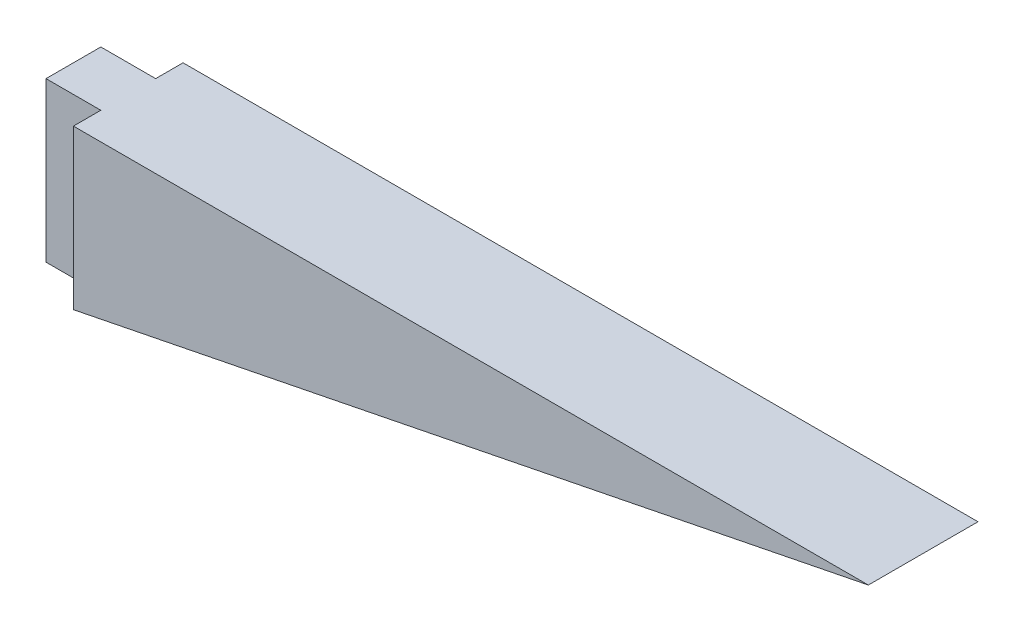
ISO-10303-21;
HEADER;
FILE_DESCRIPTION(('STEP AP214'),'2;1');
FILE_NAME('part.step','',(''),(''),'','','');
FILE_SCHEMA(('AUTOMOTIVE_DESIGN { 1 0 10303 214 1 1 1 1 }'));
ENDSEC;
DATA;
#1=APPLICATION_CONTEXT('core data for automotive mechanical design processes');
#2=APPLICATION_PROTOCOL_DEFINITION('international standard','automotive_design',2000,#1);
#3=PRODUCT_CONTEXT('',#1,'mechanical');
#4=PRODUCT('Part','Part','',(#3));
#5=PRODUCT_RELATED_PRODUCT_CATEGORY('part','',(#4));
#6=PRODUCT_DEFINITION_FORMATION('','',#4);
#7=PRODUCT_DEFINITION_CONTEXT('part definition',#1,'design');
#8=PRODUCT_DEFINITION('design','',#6,#7);
#9=PRODUCT_DEFINITION_SHAPE('','',#8);
#10=(LENGTH_UNIT() NAMED_UNIT(*) SI_UNIT(.MILLI.,.METRE.));
#11=(NAMED_UNIT(*) PLANE_ANGLE_UNIT() SI_UNIT($,.RADIAN.));
#12=(NAMED_UNIT(*) SI_UNIT($,.STERADIAN.) SOLID_ANGLE_UNIT());
#13=UNCERTAINTY_MEASURE_WITH_UNIT(LENGTH_MEASURE(1.E-05),#10,'distance_accuracy_value','');
#14=(GEOMETRIC_REPRESENTATION_CONTEXT(3) GLOBAL_UNCERTAINTY_ASSIGNED_CONTEXT((#13)) GLOBAL_UNIT_ASSIGNED_CONTEXT((#10,
#11,#12)) REPRESENTATION_CONTEXT('',''));
#15=CARTESIAN_POINT('',(0.,0.,0.));
#16=DIRECTION('',(0.,0.,1.));
#17=DIRECTION('',(1.,0.,0.));
#18=AXIS2_PLACEMENT_3D('',#15,#16,#17);
#19=CARTESIAN_POINT('',(0.,3.,0.));
#20=DIRECTION('',(1.,0.,0.));
#21=DIRECTION('',(0.,0.,-1.));
#22=AXIS2_PLACEMENT_3D('',#19,#20,#21);
#23=PLANE('',#22);
#24=DIRECTION('',(0.,-1.,0.));
#25=VECTOR('',#24,1.);
#26=CARTESIAN_POINT('',(0.,3.,-1.5));
#27=LINE('',#26,#25);
#28=CARTESIAN_POINT('',(0.,3.,-1.5));
#29=VERTEX_POINT('',#28);
#30=CARTESIAN_POINT('',(0.,0.1000000010582,-1.5));
#31=VERTEX_POINT('',#30);
#32=EDGE_CURVE('E50',#29,#31,#27,.T.);
#33=ORIENTED_EDGE('',*,*,#32,.F.);
#34=DIRECTION('',(0.,0.,1.));
#35=VECTOR('',#34,1.);
#36=CARTESIAN_POINT('',(0.,3.,0.));
#37=LINE('',#36,#35);
#38=CARTESIAN_POINT('',(0.,3.,-2.));
#39=VERTEX_POINT('',#38);
#40=EDGE_CURVE('E157',#39,#29,#37,.T.);
#41=ORIENTED_EDGE('',*,*,#40,.F.);
#42=DIRECTION('',(0.,-1.,0.));
#43=VECTOR('',#42,1.);
#44=CARTESIAN_POINT('',(0.,3.,-2.));
#45=LINE('',#44,#43);
#46=CARTESIAN_POINT('',(0.,0.1000000010582,-2.));
#47=VERTEX_POINT('',#46);
#48=EDGE_CURVE('E42',#39,#47,#45,.T.);
#49=ORIENTED_EDGE('',*,*,#48,.T.);
#50=DIRECTION('',(0.,0.,1.));
#51=VECTOR('',#50,1.);
#52=CARTESIAN_POINT('',(0.,0.1000000010582,0.));
#53=LINE('',#52,#51);
#54=EDGE_CURVE('E167',#47,#31,#53,.T.);
#55=ORIENTED_EDGE('',*,*,#54,.T.);
#56=EDGE_LOOP('',(#33,#41,#49,#55));
#57=FACE_BOUND('',#56,.T.);
#58=ADVANCED_FACE('F34',(#57),#23,.F.);
#59=DIRECTION('',(0.,1.,0.));
#60=VECTOR('',#59,1.);
#61=CARTESIAN_POINT('',(0.,3.,-0.5));
#62=LINE('',#61,#60);
#63=CARTESIAN_POINT('',(0.,0.1000000010582,-0.5));
#64=VERTEX_POINT('',#63);
#65=CARTESIAN_POINT('',(0.,3.,-0.5));
#66=VERTEX_POINT('',#65);
#67=EDGE_CURVE('E58',#64,#66,#62,.T.);
#68=ORIENTED_EDGE('',*,*,#67,.F.);
#69=CARTESIAN_POINT('',(0.,0.1000000010582,0.));
#70=VERTEX_POINT('',#69);
#71=EDGE_CURVE('E169',#64,#70,#53,.T.);
#72=ORIENTED_EDGE('',*,*,#71,.T.);
#73=DIRECTION('',(0.,-1.,0.));
#74=VECTOR('',#73,1.);
#75=CARTESIAN_POINT('',(0.,3.,0.));
#76=LINE('',#75,#74);
#77=CARTESIAN_POINT('',(0.,3.,0.));
#78=VERTEX_POINT('',#77);
#79=EDGE_CURVE('E11',#78,#70,#76,.T.);
#80=ORIENTED_EDGE('',*,*,#79,.F.);
#81=EDGE_CURVE('E142',#66,#78,#37,.T.);
#82=ORIENTED_EDGE('',*,*,#81,.F.);
#83=EDGE_LOOP('',(#68,#72,#80,#82));
#84=FACE_BOUND('',#83,.T.);
#85=ADVANCED_FACE('F183',(#84),#23,.F.);
#86=CARTESIAN_POINT('',(0.,3.,0.));
#87=DIRECTION('',(0.,0.,-1.));
#88=DIRECTION('',(-1.,0.,0.));
#89=AXIS2_PLACEMENT_3D('',#86,#87,#88);
#90=PLANE('',#89);
#91=ORIENTED_EDGE('',*,*,#79,.T.);
#92=DIRECTION('',(-0.980580675704682,-0.196116135069374,0.));
#93=VECTOR('',#92,1.);
#94=CARTESIAN_POINT('',(14.5,3.,0.));
#95=LINE('',#94,#93);
#96=CARTESIAN_POINT('',(14.5,3.,0.));
#97=VERTEX_POINT('',#96);
#98=EDGE_CURVE('E118',#97,#70,#95,.T.);
#99=ORIENTED_EDGE('',*,*,#98,.F.);
#100=DIRECTION('',(1.,0.,0.));
#101=VECTOR('',#100,1.);
#102=CARTESIAN_POINT('',(0.,3.,0.));
#103=LINE('',#102,#101);
#104=EDGE_CURVE('E163',#78,#97,#103,.T.);
#105=ORIENTED_EDGE('',*,*,#104,.F.);
#106=EDGE_LOOP('',(#91,#99,#105));
#107=FACE_BOUND('',#106,.T.);
#108=ADVANCED_FACE('F187',(#107),#90,.F.);
#109=CARTESIAN_POINT('',(0.,3.,-2.));
#110=DIRECTION('',(0.,0.,1.));
#111=DIRECTION('',(1.,0.,0.));
#112=AXIS2_PLACEMENT_3D('',#109,#110,#111);
#113=PLANE('',#112);
#114=DIRECTION('',(-1.,0.,0.));
#115=VECTOR('',#114,1.);
#116=CARTESIAN_POINT('',(0.,3.,-2.));
#117=LINE('',#116,#115);
#118=CARTESIAN_POINT('',(14.5,3.,-2.));
#119=VERTEX_POINT('',#118);
#120=EDGE_CURVE('E160',#119,#39,#117,.T.);
#121=ORIENTED_EDGE('',*,*,#120,.F.);
#122=DIRECTION('',(-0.980580675704682,-0.196116135069374,0.));
#123=VECTOR('',#122,1.);
#124=CARTESIAN_POINT('',(0.557692307300962,0.211538462477693,-2.));
#125=LINE('',#124,#123);
#126=EDGE_CURVE('E121',#119,#47,#125,.T.);
#127=ORIENTED_EDGE('',*,*,#126,.T.);
#128=ORIENTED_EDGE('',*,*,#48,.F.);
#129=EDGE_LOOP('',(#121,#127,#128));
#130=FACE_BOUND('',#129,.T.);
#131=ADVANCED_FACE('F181',(#130),#113,.F.);
#132=CARTESIAN_POINT('',(0.,3.,0.));
#133=DIRECTION('',(0.,-1.,0.));
#134=DIRECTION('',(0.,0.,-1.));
#135=AXIS2_PLACEMENT_3D('',#132,#133,#134);
#136=PLANE('',#135);
#137=ORIENTED_EDGE('',*,*,#40,.T.);
#138=DIRECTION('',(1.,0.,0.));
#139=VECTOR('',#138,1.);
#140=CARTESIAN_POINT('',(-1.,3.,-1.5));
#141=LINE('',#140,#139);
#142=CARTESIAN_POINT('',(-1.,3.,-1.5));
#143=VERTEX_POINT('',#142);
#144=EDGE_CURVE('E132',#143,#29,#141,.T.);
#145=ORIENTED_EDGE('',*,*,#144,.F.);
#146=DIRECTION('',(0.,0.,-1.));
#147=VECTOR('',#146,1.);
#148=CARTESIAN_POINT('',(-1.,3.,-1.5));
#149=LINE('',#148,#147);
#150=CARTESIAN_POINT('',(-1.,3.,-0.5));
#151=VERTEX_POINT('',#150);
#152=EDGE_CURVE('E112',#151,#143,#149,.T.);
#153=ORIENTED_EDGE('',*,*,#152,.F.);
#154=DIRECTION('',(1.,0.,0.));
#155=VECTOR('',#154,1.);
#156=CARTESIAN_POINT('',(-1.,3.,-0.5));
#157=LINE('',#156,#155);
#158=EDGE_CURVE('E123',#151,#66,#157,.T.);
#159=ORIENTED_EDGE('',*,*,#158,.T.);
#160=ORIENTED_EDGE('',*,*,#81,.T.);
#161=ORIENTED_EDGE('',*,*,#104,.T.);
#162=DIRECTION('',(0.,0.,-1.));
#163=VECTOR('',#162,1.);
#164=CARTESIAN_POINT('',(14.5,3.,0.));
#165=LINE('',#164,#163);
#166=EDGE_CURVE('E165',#97,#119,#165,.T.);
#167=ORIENTED_EDGE('',*,*,#166,.T.);
#168=ORIENTED_EDGE('',*,*,#120,.T.);
#169=EDGE_LOOP('',(#137,#145,#153,#159,#160,#161,#167,#168));
#170=FACE_BOUND('',#169,.T.);
#171=ADVANCED_FACE('F156',(#170),#136,.F.);
#172=CARTESIAN_POINT('',(14.5,3.,-10.));
#173=DIRECTION('',(-0.196116135069374,0.980580675704682,0.));
#174=DIRECTION('',(-0.980580675704682,-0.196116135069374,0.));
#175=AXIS2_PLACEMENT_3D('',#172,#173,#174);
#176=PLANE('',#175);
#177=ORIENTED_EDGE('',*,*,#126,.F.);
#178=ORIENTED_EDGE('',*,*,#166,.F.);
#179=ORIENTED_EDGE('',*,*,#98,.T.);
#180=ORIENTED_EDGE('',*,*,#71,.F.);
#181=DIRECTION('',(0.,0.,1.));
#182=VECTOR('',#181,1.);
#183=CARTESIAN_POINT('',(0.,0.1000000010582,-1.5));
#184=LINE('',#183,#182);
#185=EDGE_CURVE('E131',#31,#64,#184,.T.);
#186=ORIENTED_EDGE('',*,*,#185,.F.);
#187=ORIENTED_EDGE('',*,*,#54,.F.);
#188=EDGE_LOOP('',(#177,#178,#179,#180,#186,#187));
#189=FACE_BOUND('',#188,.T.);
#190=ADVANCED_FACE('F199',(#189),#176,.F.);
#191=CARTESIAN_POINT('',(-1.,3.,-1.5));
#192=DIRECTION('',(0.,0.,1.));
#193=DIRECTION('',(0.,-1.,0.));
#194=AXIS2_PLACEMENT_3D('',#191,#192,#193);
#195=PLANE('',#194);
#196=ORIENTED_EDGE('',*,*,#32,.T.);
#197=DIRECTION('',(1.,0.,0.));
#198=VECTOR('',#197,1.);
#199=CARTESIAN_POINT('',(-1.,0.1000000010582,-1.5));
#200=LINE('',#199,#198);
#201=CARTESIAN_POINT('',(-1.,0.1000000010582,-1.5));
#202=VERTEX_POINT('',#201);
#203=EDGE_CURVE('E101',#202,#31,#200,.T.);
#204=ORIENTED_EDGE('',*,*,#203,.F.);
#205=DIRECTION('',(0.,-1.,0.));
#206=VECTOR('',#205,1.);
#207=CARTESIAN_POINT('',(-1.,3.,-1.5));
#208=LINE('',#207,#206);
#209=EDGE_CURVE('E107',#143,#202,#208,.T.);
#210=ORIENTED_EDGE('',*,*,#209,.F.);
#211=ORIENTED_EDGE('',*,*,#144,.T.);
#212=EDGE_LOOP('',(#196,#204,#210,#211));
#213=FACE_BOUND('',#212,.T.);
#214=ADVANCED_FACE('F117',(#213),#195,.F.);
#215=CARTESIAN_POINT('',(-1.,0.1000000010582,-1.5));
#216=DIRECTION('',(0.,1.,0.));
#217=DIRECTION('',(0.,0.,1.));
#218=AXIS2_PLACEMENT_3D('',#215,#216,#217);
#219=PLANE('',#218);
#220=ORIENTED_EDGE('',*,*,#185,.T.);
#221=DIRECTION('',(1.,0.,0.));
#222=VECTOR('',#221,1.);
#223=CARTESIAN_POINT('',(-1.,0.1000000010582,-0.5));
#224=LINE('',#223,#222);
#225=CARTESIAN_POINT('',(-1.,0.1000000010582,-0.5));
#226=VERTEX_POINT('',#225);
#227=EDGE_CURVE('E103',#226,#64,#224,.T.);
#228=ORIENTED_EDGE('',*,*,#227,.F.);
#229=DIRECTION('',(0.,0.,1.));
#230=VECTOR('',#229,1.);
#231=CARTESIAN_POINT('',(-1.,0.1000000010582,-1.5));
#232=LINE('',#231,#230);
#233=EDGE_CURVE('E96',#202,#226,#232,.T.);
#234=ORIENTED_EDGE('',*,*,#233,.F.);
#235=ORIENTED_EDGE('',*,*,#203,.T.);
#236=EDGE_LOOP('',(#220,#228,#234,#235));
#237=FACE_BOUND('',#236,.T.);
#238=ADVANCED_FACE('F99',(#237),#219,.F.);
#239=CARTESIAN_POINT('',(-1.,3.,-0.5));
#240=DIRECTION('',(0.,0.,-1.));
#241=DIRECTION('',(0.,1.,0.));
#242=AXIS2_PLACEMENT_3D('',#239,#240,#241);
#243=PLANE('',#242);
#244=ORIENTED_EDGE('',*,*,#67,.T.);
#245=ORIENTED_EDGE('',*,*,#158,.F.);
#246=DIRECTION('',(0.,1.,0.));
#247=VECTOR('',#246,1.);
#248=CARTESIAN_POINT('',(-1.,3.,-0.5));
#249=LINE('',#248,#247);
#250=EDGE_CURVE('E106',#226,#151,#249,.T.);
#251=ORIENTED_EDGE('',*,*,#250,.F.);
#252=ORIENTED_EDGE('',*,*,#227,.T.);
#253=EDGE_LOOP('',(#244,#245,#251,#252));
#254=FACE_BOUND('',#253,.T.);
#255=ADVANCED_FACE('F153',(#254),#243,.F.);
#256=CARTESIAN_POINT('',(-1.,0.,0.));
#257=DIRECTION('',(-1.,0.,0.));
#258=DIRECTION('',(0.,0.,1.));
#259=AXIS2_PLACEMENT_3D('',#256,#257,#258);
#260=PLANE('',#259);
#261=ORIENTED_EDGE('',*,*,#209,.T.);
#262=ORIENTED_EDGE('',*,*,#233,.T.);
#263=ORIENTED_EDGE('',*,*,#250,.T.);
#264=ORIENTED_EDGE('',*,*,#152,.T.);
#265=EDGE_LOOP('',(#261,#262,#263,#264));
#266=FACE_BOUND('',#265,.T.);
#267=ADVANCED_FACE('F110',(#266),#260,.T.);
#268=CLOSED_SHELL('',(#58,#85,#108,#131,#171,#190,#214,#238,#255,#267));
#269=MANIFOLD_SOLID_BREP('B2',#268);
#270=ADVANCED_BREP_SHAPE_REPRESENTATION('',(#18,#269),#14);
#271=SHAPE_DEFINITION_REPRESENTATION(#9,#270);
ENDSEC;
END-ISO-10303-21;
